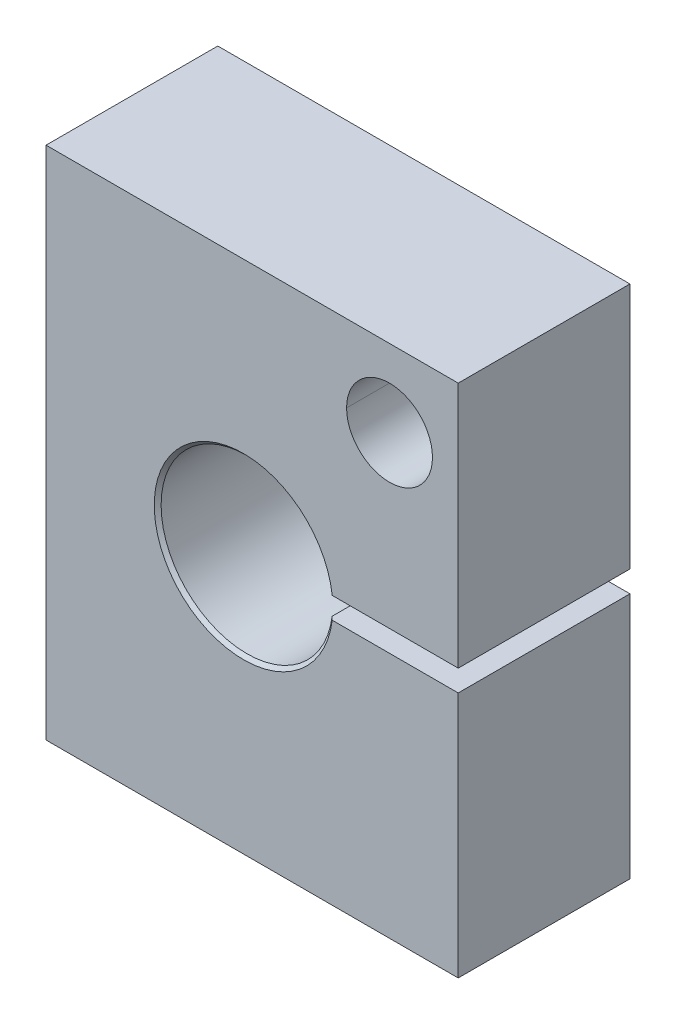
ISO-10303-21;
HEADER;
FILE_DESCRIPTION(('STEP AP214'),'2;1');
FILE_NAME('part.step','',(''),(''),'','','');
FILE_SCHEMA(('AUTOMOTIVE_DESIGN { 1 0 10303 214 1 1 1 1 }'));
ENDSEC;
DATA;
#1=APPLICATION_CONTEXT('core data for automotive mechanical design processes');
#2=APPLICATION_PROTOCOL_DEFINITION('international standard','automotive_design',2000,#1);
#3=PRODUCT_CONTEXT('',#1,'mechanical');
#4=PRODUCT('Part','Part','',(#3));
#5=PRODUCT_RELATED_PRODUCT_CATEGORY('part','',(#4));
#6=PRODUCT_DEFINITION_FORMATION('','',#4);
#7=PRODUCT_DEFINITION_CONTEXT('part definition',#1,'design');
#8=PRODUCT_DEFINITION('design','',#6,#7);
#9=PRODUCT_DEFINITION_SHAPE('','',#8);
#10=(LENGTH_UNIT() NAMED_UNIT(*) SI_UNIT(.MILLI.,.METRE.));
#11=(NAMED_UNIT(*) PLANE_ANGLE_UNIT() SI_UNIT($,.RADIAN.));
#12=(NAMED_UNIT(*) SI_UNIT($,.STERADIAN.) SOLID_ANGLE_UNIT());
#13=UNCERTAINTY_MEASURE_WITH_UNIT(LENGTH_MEASURE(1.E-05),#10,'distance_accuracy_value','');
#14=(GEOMETRIC_REPRESENTATION_CONTEXT(3) GLOBAL_UNCERTAINTY_ASSIGNED_CONTEXT((#13)) GLOBAL_UNIT_ASSIGNED_CONTEXT((#10,
#11,#12)) REPRESENTATION_CONTEXT('',''));
#15=CARTESIAN_POINT('',(0.,0.,0.));
#16=DIRECTION('',(0.,0.,1.));
#17=DIRECTION('',(1.,0.,0.));
#18=AXIS2_PLACEMENT_3D('',#15,#16,#17);
#19=CARTESIAN_POINT('',(10.16,13.335,-6.35));
#20=DIRECTION('',(0.,0.,1.));
#21=DIRECTION('',(1.,0.,0.));
#22=AXIS2_PLACEMENT_3D('',#19,#20,#21);
#23=CYLINDRICAL_SURFACE('',#22,3.175);
#24=CARTESIAN_POINT('',(10.16,13.335,-6.35));
#25=DIRECTION('',(0.,0.,1.));
#26=DIRECTION('',(1.,0.,0.));
#27=AXIS2_PLACEMENT_3D('',#24,#25,#26);
#28=CIRCLE('',#27,3.175);
#29=CARTESIAN_POINT('',(6.985,13.335,-6.35));
#30=VERTEX_POINT('',#29);
#31=CARTESIAN_POINT('',(13.335,13.335,-6.35));
#32=VERTEX_POINT('',#31);
#33=EDGE_CURVE('E508',#30,#32,#28,.T.);
#34=ORIENTED_EDGE('',*,*,#33,.F.);
#35=DIRECTION('',(0.,0.,1.));
#36=VECTOR('',#35,1.);
#37=CARTESIAN_POINT('',(6.985,13.335,-6.35));
#38=LINE('',#37,#36);
#39=CARTESIAN_POINT('',(6.985,13.335,6.35));
#40=VERTEX_POINT('',#39);
#41=EDGE_CURVE('E11',#30,#40,#38,.T.);
#42=ORIENTED_EDGE('',*,*,#41,.T.);
#43=CARTESIAN_POINT('',(10.16,13.335,6.35));
#44=DIRECTION('',(0.,0.,1.));
#45=DIRECTION('',(1.,0.,0.));
#46=AXIS2_PLACEMENT_3D('',#43,#44,#45);
#47=CIRCLE('',#46,3.175);
#48=CARTESIAN_POINT('',(13.335,13.335,6.35));
#49=VERTEX_POINT('',#48);
#50=EDGE_CURVE('E509',#40,#49,#47,.T.);
#51=ORIENTED_EDGE('',*,*,#50,.T.);
#52=DIRECTION('',(0.,0.,-1.));
#53=VECTOR('',#52,1.);
#54=CARTESIAN_POINT('',(13.335,13.335,-6.35));
#55=LINE('',#54,#53);
#56=EDGE_CURVE('E56',#49,#32,#55,.T.);
#57=ORIENTED_EDGE('',*,*,#56,.T.);
#58=EDGE_LOOP('',(#34,#42,#51,#57));
#59=FACE_BOUND('',#58,.T.);
#60=ADVANCED_FACE('F46',(#59),#23,.F.);
#61=CARTESIAN_POINT('',(-15.24,-19.05,6.35));
#62=DIRECTION('',(0.,1.,0.));
#63=DIRECTION('',(0.,0.,1.));
#64=AXIS2_PLACEMENT_3D('',#61,#62,#63);
#65=PLANE('',#64);
#66=CARTESIAN_POINT('',(-8.89,-19.05,0.));
#67=DIRECTION('',(0.,-1.,0.));
#68=DIRECTION('',(0.,0.,-1.));
#69=AXIS2_PLACEMENT_3D('',#66,#67,#68);
#70=CIRCLE('',#69,3.175);
#71=CARTESIAN_POINT('',(-8.89,-19.05,-3.175));
#72=VERTEX_POINT('',#71);
#73=EDGE_CURVE('E175',#72,#72,#70,.T.);
#74=ORIENTED_EDGE('',*,*,#73,.F.);
#75=EDGE_LOOP('',(#74));
#76=FACE_BOUND('',#75,.T.);
#77=DIRECTION('',(1.,0.,0.));
#78=VECTOR('',#77,1.);
#79=CARTESIAN_POINT('',(-15.24,-19.05,-6.35));
#80=LINE('',#79,#78);
#81=CARTESIAN_POINT('',(-15.24,-19.05,-6.35));
#82=VERTEX_POINT('',#81);
#83=CARTESIAN_POINT('',(15.24,-19.05,-6.35));
#84=VERTEX_POINT('',#83);
#85=EDGE_CURVE('E239',#82,#84,#80,.T.);
#86=ORIENTED_EDGE('',*,*,#85,.T.);
#87=DIRECTION('',(0.,0.,-1.));
#88=VECTOR('',#87,1.);
#89=CARTESIAN_POINT('',(15.24,-19.05,6.35));
#90=LINE('',#89,#88);
#91=CARTESIAN_POINT('',(15.24,-19.05,6.35));
#92=VERTEX_POINT('',#91);
#93=EDGE_CURVE('E228',#92,#84,#90,.T.);
#94=ORIENTED_EDGE('',*,*,#93,.F.);
#95=DIRECTION('',(1.,0.,0.));
#96=VECTOR('',#95,1.);
#97=CARTESIAN_POINT('',(-15.24,-19.05,6.35));
#98=LINE('',#97,#96);
#99=CARTESIAN_POINT('',(-15.24,-19.05,6.35));
#100=VERTEX_POINT('',#99);
#101=EDGE_CURVE('E226',#100,#92,#98,.T.);
#102=ORIENTED_EDGE('',*,*,#101,.F.);
#103=DIRECTION('',(0.,0.,-1.));
#104=VECTOR('',#103,1.);
#105=CARTESIAN_POINT('',(-15.24,-19.05,6.35));
#106=LINE('',#105,#104);
#107=EDGE_CURVE('E245',#100,#82,#106,.T.);
#108=ORIENTED_EDGE('',*,*,#107,.T.);
#109=EDGE_LOOP('',(#86,#94,#102,#108));
#110=FACE_BOUND('',#109,.T.);
#111=CARTESIAN_POINT('',(8.89,-19.05,0.));
#112=DIRECTION('',(0.,-1.,0.));
#113=DIRECTION('',(0.,0.,-1.));
#114=AXIS2_PLACEMENT_3D('',#111,#112,#113);
#115=CIRCLE('',#114,3.175);
#116=CARTESIAN_POINT('',(8.89,-19.05,-3.175));
#117=VERTEX_POINT('',#116);
#118=EDGE_CURVE('E174',#117,#117,#115,.T.);
#119=ORIENTED_EDGE('',*,*,#118,.F.);
#120=EDGE_LOOP('',(#119));
#121=FACE_BOUND('',#120,.T.);
#122=ADVANCED_FACE('F336',(#76,#110,#121),#65,.F.);
#123=CARTESIAN_POINT('',(15.24,19.05,6.35));
#124=DIRECTION('',(-1.,0.,0.));
#125=DIRECTION('',(0.,-1.,0.));
#126=AXIS2_PLACEMENT_3D('',#123,#124,#125);
#127=PLANE('',#126);
#128=DIRECTION('',(0.,1.,0.));
#129=VECTOR('',#128,1.);
#130=CARTESIAN_POINT('',(15.24,19.05,6.35));
#131=LINE('',#130,#129);
#132=CARTESIAN_POINT('',(15.24,0.793749999999996,6.35));
#133=VERTEX_POINT('',#132);
#134=CARTESIAN_POINT('',(15.24,19.05,6.35));
#135=VERTEX_POINT('',#134);
#136=EDGE_CURVE('E220',#133,#135,#131,.T.);
#137=ORIENTED_EDGE('',*,*,#136,.F.);
#138=DIRECTION('',(0.,0.,-1.));
#139=VECTOR('',#138,1.);
#140=CARTESIAN_POINT('',(15.24,0.793749999999996,6.35));
#141=LINE('',#140,#139);
#142=CARTESIAN_POINT('',(15.24,0.793749999999996,-6.35));
#143=VERTEX_POINT('',#142);
#144=EDGE_CURVE('E200',#133,#143,#141,.T.);
#145=ORIENTED_EDGE('',*,*,#144,.T.);
#146=DIRECTION('',(0.,1.,0.));
#147=VECTOR('',#146,1.);
#148=CARTESIAN_POINT('',(15.24,19.05,-6.35));
#149=LINE('',#148,#147);
#150=CARTESIAN_POINT('',(15.24,19.05,-6.35));
#151=VERTEX_POINT('',#150);
#152=EDGE_CURVE('E214',#143,#151,#149,.T.);
#153=ORIENTED_EDGE('',*,*,#152,.T.);
#154=DIRECTION('',(0.,0.,-1.));
#155=VECTOR('',#154,1.);
#156=CARTESIAN_POINT('',(15.24,19.05,6.35));
#157=LINE('',#156,#155);
#158=EDGE_CURVE('E253',#135,#151,#157,.T.);
#159=ORIENTED_EDGE('',*,*,#158,.F.);
#160=EDGE_LOOP('',(#137,#145,#153,#159));
#161=FACE_BOUND('',#160,.T.);
#162=ADVANCED_FACE('F327',(#161),#127,.F.);
#163=CARTESIAN_POINT('',(15.24,-0.793749999999996,-6.35));
#164=VERTEX_POINT('',#163);
#165=EDGE_CURVE('E229',#84,#164,#149,.T.);
#166=ORIENTED_EDGE('',*,*,#165,.T.);
#167=DIRECTION('',(0.,0.,-1.));
#168=VECTOR('',#167,1.);
#169=CARTESIAN_POINT('',(15.24,-0.793750000000003,6.35));
#170=LINE('',#169,#168);
#171=CARTESIAN_POINT('',(15.24,-0.793750000000003,6.35));
#172=VERTEX_POINT('',#171);
#173=EDGE_CURVE('E191',#172,#164,#170,.T.);
#174=ORIENTED_EDGE('',*,*,#173,.F.);
#175=EDGE_CURVE('E215',#92,#172,#131,.T.);
#176=ORIENTED_EDGE('',*,*,#175,.F.);
#177=ORIENTED_EDGE('',*,*,#93,.T.);
#178=EDGE_LOOP('',(#166,#174,#176,#177));
#179=FACE_BOUND('',#178,.T.);
#180=ADVANCED_FACE('F322',(#179),#127,.F.);
#181=CARTESIAN_POINT('',(-15.24,19.05,6.35));
#182=DIRECTION('',(0.,-1.,0.));
#183=DIRECTION('',(0.,0.,-1.));
#184=AXIS2_PLACEMENT_3D('',#181,#182,#183);
#185=PLANE('',#184);
#186=DIRECTION('',(-1.,0.,0.));
#187=VECTOR('',#186,1.);
#188=CARTESIAN_POINT('',(-15.24,19.05,-6.35));
#189=LINE('',#188,#187);
#190=CARTESIAN_POINT('',(-15.24,19.05,-6.35));
#191=VERTEX_POINT('',#190);
#192=EDGE_CURVE('E233',#151,#191,#189,.T.);
#193=ORIENTED_EDGE('',*,*,#192,.T.);
#194=DIRECTION('',(0.,0.,-1.));
#195=VECTOR('',#194,1.);
#196=CARTESIAN_POINT('',(-15.24,19.05,6.35));
#197=LINE('',#196,#195);
#198=CARTESIAN_POINT('',(-15.24,19.05,6.35));
#199=VERTEX_POINT('',#198);
#200=EDGE_CURVE('E249',#199,#191,#197,.T.);
#201=ORIENTED_EDGE('',*,*,#200,.F.);
#202=DIRECTION('',(-1.,0.,0.));
#203=VECTOR('',#202,1.);
#204=CARTESIAN_POINT('',(-15.24,19.05,6.35));
#205=LINE('',#204,#203);
#206=EDGE_CURVE('E219',#135,#199,#205,.T.);
#207=ORIENTED_EDGE('',*,*,#206,.F.);
#208=ORIENTED_EDGE('',*,*,#158,.T.);
#209=EDGE_LOOP('',(#193,#201,#207,#208));
#210=FACE_BOUND('',#209,.T.);
#211=ADVANCED_FACE('F326',(#210),#185,.F.);
#212=CARTESIAN_POINT('',(-15.24,19.05,6.35));
#213=DIRECTION('',(1.,0.,0.));
#214=DIRECTION('',(0.,1.,0.));
#215=AXIS2_PLACEMENT_3D('',#212,#213,#214);
#216=PLANE('',#215);
#217=DIRECTION('',(0.,-1.,0.));
#218=VECTOR('',#217,1.);
#219=CARTESIAN_POINT('',(-15.24,19.05,-6.35));
#220=LINE('',#219,#218);
#221=EDGE_CURVE('E236',#191,#82,#220,.T.);
#222=ORIENTED_EDGE('',*,*,#221,.T.);
#223=ORIENTED_EDGE('',*,*,#107,.F.);
#224=DIRECTION('',(0.,-1.,0.));
#225=VECTOR('',#224,1.);
#226=CARTESIAN_POINT('',(-15.24,19.05,6.35));
#227=LINE('',#226,#225);
#228=EDGE_CURVE('E223',#199,#100,#227,.T.);
#229=ORIENTED_EDGE('',*,*,#228,.F.);
#230=ORIENTED_EDGE('',*,*,#200,.T.);
#231=EDGE_LOOP('',(#222,#223,#229,#230));
#232=FACE_BOUND('',#231,.T.);
#233=ADVANCED_FACE('F331',(#232),#216,.F.);
#234=CARTESIAN_POINT('',(0.,0.,6.35));
#235=DIRECTION('',(0.,0.,1.));
#236=DIRECTION('',(1.,0.,0.));
#237=AXIS2_PLACEMENT_3D('',#234,#235,#236);
#238=PLANE('',#237);
#239=EDGE_CURVE('E506',#49,#40,#47,.T.);
#240=ORIENTED_EDGE('',*,*,#239,.F.);
#241=ORIENTED_EDGE('',*,*,#50,.F.);
#242=EDGE_LOOP('',(#240,#241));
#243=FACE_BOUND('',#242,.T.);
#244=DIRECTION('',(-1.,0.,0.));
#245=VECTOR('',#244,1.);
#246=CARTESIAN_POINT('',(15.24,-0.793750000000003,6.35));
#247=LINE('',#246,#245);
#248=CARTESIAN_POINT('',(5.92112514657092,-0.793750000000003,6.35));
#249=VERTEX_POINT('',#248);
#250=EDGE_CURVE('E192',#172,#249,#247,.T.);
#251=ORIENTED_EDGE('',*,*,#250,.T.);
#252=CARTESIAN_POINT('',(-0.635,0.,6.35));
#253=DIRECTION('',(0.,0.,1.));
#254=DIRECTION('',(1.,0.,0.));
#255=AXIS2_PLACEMENT_3D('',#252,#253,#254);
#256=CIRCLE('',#255,6.60399999999997);
#257=CARTESIAN_POINT('',(5.92112514657092,0.793749999999995,6.35));
#258=VERTEX_POINT('',#257);
#259=EDGE_CURVE('E315',#249,#258,#256,.F.);
#260=ORIENTED_EDGE('',*,*,#259,.T.);
#261=DIRECTION('',(1.,0.,0.));
#262=VECTOR('',#261,1.);
#263=CARTESIAN_POINT('',(15.24,0.793749999999996,6.35));
#264=LINE('',#263,#262);
#265=EDGE_CURVE('E197',#258,#133,#264,.T.);
#266=ORIENTED_EDGE('',*,*,#265,.T.);
#267=ORIENTED_EDGE('',*,*,#136,.T.);
#268=ORIENTED_EDGE('',*,*,#206,.T.);
#269=ORIENTED_EDGE('',*,*,#228,.T.);
#270=ORIENTED_EDGE('',*,*,#101,.T.);
#271=ORIENTED_EDGE('',*,*,#175,.T.);
#272=EDGE_LOOP('',(#251,#260,#266,#267,#268,#269,#270,#271));
#273=FACE_BOUND('',#272,.T.);
#274=ADVANCED_FACE('F299',(#243,#273),#238,.T.);
#275=CARTESIAN_POINT('',(0.,0.,-6.35));
#276=DIRECTION('',(0.,0.,1.));
#277=DIRECTION('',(1.,0.,0.));
#278=AXIS2_PLACEMENT_3D('',#275,#276,#277);
#279=PLANE('',#278);
#280=EDGE_CURVE('E184',#32,#30,#28,.T.);
#281=ORIENTED_EDGE('',*,*,#280,.T.);
#282=ORIENTED_EDGE('',*,*,#33,.T.);
#283=EDGE_LOOP('',(#281,#282));
#284=FACE_BOUND('',#283,.T.);
#285=DIRECTION('',(-1.,0.,0.));
#286=VECTOR('',#285,1.);
#287=CARTESIAN_POINT('',(0.,0.793749999999994,-6.35));
#288=LINE('',#287,#286);
#289=CARTESIAN_POINT('',(5.92112514657092,0.793749999999995,-6.35));
#290=VERTEX_POINT('',#289);
#291=EDGE_CURVE('E260',#143,#290,#288,.T.);
#292=ORIENTED_EDGE('',*,*,#291,.T.);
#293=CARTESIAN_POINT('',(-0.635,0.,-6.35));
#294=DIRECTION('',(0.,0.,1.));
#295=DIRECTION('',(1.,0.,0.));
#296=AXIS2_PLACEMENT_3D('',#293,#294,#295);
#297=CIRCLE('',#296,6.60399999999997);
#298=CARTESIAN_POINT('',(5.92112514657092,-0.793750000000003,-6.35));
#299=VERTEX_POINT('',#298);
#300=EDGE_CURVE('E264',#290,#299,#297,.T.);
#301=ORIENTED_EDGE('',*,*,#300,.T.);
#302=DIRECTION('',(1.,0.,0.));
#303=VECTOR('',#302,1.);
#304=CARTESIAN_POINT('',(0.,-0.793750000000003,-6.35));
#305=LINE('',#304,#303);
#306=EDGE_CURVE('E257',#299,#164,#305,.T.);
#307=ORIENTED_EDGE('',*,*,#306,.T.);
#308=ORIENTED_EDGE('',*,*,#165,.F.);
#309=ORIENTED_EDGE('',*,*,#85,.F.);
#310=ORIENTED_EDGE('',*,*,#221,.F.);
#311=ORIENTED_EDGE('',*,*,#192,.F.);
#312=ORIENTED_EDGE('',*,*,#152,.F.);
#313=EDGE_LOOP('',(#292,#301,#307,#308,#309,#310,#311,#312));
#314=FACE_BOUND('',#313,.T.);
#315=ADVANCED_FACE('F297',(#284,#314),#279,.F.);
#316=CARTESIAN_POINT('',(15.24,0.793749999999996,6.35));
#317=DIRECTION('',(0.,1.,0.));
#318=DIRECTION('',(-1.,0.,0.));
#319=AXIS2_PLACEMENT_3D('',#316,#317,#318);
#320=PLANE('',#319);
#321=DIRECTION('',(0.,0.,-1.));
#322=VECTOR('',#321,1.);
#323=CARTESIAN_POINT('',(5.66519530947256,0.793749999999995,6.35));
#324=LINE('',#323,#322);
#325=CARTESIAN_POINT('',(5.66519530947256,0.793749999999995,6.09600000000003));
#326=VERTEX_POINT('',#325);
#327=CARTESIAN_POINT('',(5.66519530947256,0.793749999999995,-6.09600000000003));
#328=VERTEX_POINT('',#327);
#329=EDGE_CURVE('E201',#326,#328,#324,.T.);
#330=ORIENTED_EDGE('',*,*,#329,.T.);
#331=CARTESIAN_POINT('',(5.66519530947256,0.793749999999995,-6.09600000000003));
#332=CARTESIAN_POINT('',(5.70785661276119,0.793749999999995,-6.1383269548065));
#333=CARTESIAN_POINT('',(5.7505147508327,0.793749999999995,-6.18065709887872));
#334=CARTESIAN_POINT('',(5.83582469653216,0.793749999999995,-6.26532376554538));
#335=CARTESIAN_POINT('',(5.8784765041601,0.793749999999995,-6.30766028813982));
#336=CARTESIAN_POINT('',(5.92112514657092,0.793749999999995,-6.35));
#337=B_SPLINE_CURVE_WITH_KNOTS('',3,(#331,#332,#333,#334,#335,#336),.UNSPECIFIED.,.F.,.F.,(4,2,
4),(0.,0.180288714478005,0.360577428916484),.UNSPECIFIED.);
#338=EDGE_CURVE('E309',#328,#290,#337,.T.);
#339=ORIENTED_EDGE('',*,*,#338,.T.);
#340=ORIENTED_EDGE('',*,*,#291,.F.);
#341=ORIENTED_EDGE('',*,*,#144,.F.);
#342=ORIENTED_EDGE('',*,*,#265,.F.);
#343=CARTESIAN_POINT('',(5.92112514657092,0.793749999999995,6.35));
#344=CARTESIAN_POINT('',(5.87847650416009,0.793749999999995,6.30766028813982));
#345=CARTESIAN_POINT('',(5.83582469653216,0.793749999999995,6.26532376554538));
#346=CARTESIAN_POINT('',(5.7505147508327,0.793749999999995,6.18065709887872));
#347=CARTESIAN_POINT('',(5.70785661276119,0.793749999999995,6.1383269548065));
#348=CARTESIAN_POINT('',(5.66519530947256,0.793749999999995,6.09600000000003));
#349=B_SPLINE_CURVE_WITH_KNOTS('',3,(#343,#344,#345,#346,#347,#348),.UNSPECIFIED.,.F.,.F.,(4,2,
4),(0.,0.180288714438479,0.360577428916482),.UNSPECIFIED.);
#350=EDGE_CURVE('E303',#258,#326,#349,.T.);
#351=ORIENTED_EDGE('',*,*,#350,.T.);
#352=EDGE_LOOP('',(#330,#339,#340,#341,#342,#351));
#353=FACE_BOUND('',#352,.T.);
#354=ADVANCED_FACE('F292',(#353),#320,.F.);
#355=CARTESIAN_POINT('',(-0.635,0.,6.35));
#356=DIRECTION('',(0.,0.,-1.));
#357=DIRECTION('',(-1.,0.,0.));
#358=AXIS2_PLACEMENT_3D('',#355,#356,#357);
#359=CYLINDRICAL_SURFACE('',#358,6.35);
#360=DIRECTION('',(0.,0.,-1.));
#361=VECTOR('',#360,1.);
#362=CARTESIAN_POINT('',(5.66519530947256,-0.793750000000006,6.35));
#363=LINE('',#362,#361);
#364=CARTESIAN_POINT('',(5.66519530947256,-0.793750000000006,6.09600000000003));
#365=VERTEX_POINT('',#364);
#366=CARTESIAN_POINT('',(5.66519530947256,-0.793750000000006,-6.09600000000002));
#367=VERTEX_POINT('',#366);
#368=EDGE_CURVE('E196',#365,#367,#363,.T.);
#369=ORIENTED_EDGE('',*,*,#368,.T.);
#370=CARTESIAN_POINT('',(-0.635,0.,-6.09600000000003));
#371=DIRECTION('',(0.,0.,1.));
#372=DIRECTION('',(1.,0.,0.));
#373=AXIS2_PLACEMENT_3D('',#370,#371,#372);
#374=CIRCLE('',#373,6.35);
#375=EDGE_CURVE('E520',#367,#328,#374,.F.);
#376=ORIENTED_EDGE('',*,*,#375,.T.);
#377=ORIENTED_EDGE('',*,*,#329,.F.);
#378=CARTESIAN_POINT('',(-0.635,0.,6.09600000000003));
#379=DIRECTION('',(0.,0.,1.));
#380=DIRECTION('',(1.,0.,0.));
#381=AXIS2_PLACEMENT_3D('',#378,#379,#380);
#382=CIRCLE('',#381,6.35);
#383=EDGE_CURVE('E521',#326,#365,#382,.T.);
#384=ORIENTED_EDGE('',*,*,#383,.T.);
#385=EDGE_LOOP('',(#369,#376,#377,#384));
#386=FACE_BOUND('',#385,.T.);
#387=ADVANCED_FACE('F286',(#386),#359,.F.);
#388=CARTESIAN_POINT('',(15.24,-0.793750000000003,6.35));
#389=DIRECTION('',(0.,-1.,0.));
#390=DIRECTION('',(0.,0.,-1.));
#391=AXIS2_PLACEMENT_3D('',#388,#389,#390);
#392=PLANE('',#391);
#393=ORIENTED_EDGE('',*,*,#306,.F.);
#394=CARTESIAN_POINT('',(5.92112514657092,-0.793750000000003,-6.35));
#395=CARTESIAN_POINT('',(5.8784765041601,-0.793750000000003,-6.30766028813982));
#396=CARTESIAN_POINT('',(5.83582469653216,-0.793750000000003,-6.26532376554538));
#397=CARTESIAN_POINT('',(5.7505147508327,-0.793750000000003,-6.18065709887872));
#398=CARTESIAN_POINT('',(5.70785661276119,-0.793750000000003,-6.1383269548065));
#399=CARTESIAN_POINT('',(5.66519530947256,-0.793750000000003,-6.09600000000003));
#400=B_SPLINE_CURVE_WITH_KNOTS('',3,(#394,#395,#396,#397,#398,#399),.UNSPECIFIED.,.F.,.F.,(4,2,
4),(0.,0.180288714438479,0.360577428916484),.UNSPECIFIED.);
#401=EDGE_CURVE('E275',#299,#367,#400,.T.);
#402=ORIENTED_EDGE('',*,*,#401,.T.);
#403=ORIENTED_EDGE('',*,*,#368,.F.);
#404=CARTESIAN_POINT('',(5.66519530947256,-0.793750000000006,6.09600000000003));
#405=CARTESIAN_POINT('',(5.70785661276119,-0.793750000000004,6.1383269548065));
#406=CARTESIAN_POINT('',(5.7505147508327,-0.793750000000003,6.18065709887872));
#407=CARTESIAN_POINT('',(5.83582469653216,-0.793750000000002,6.26532376554538));
#408=CARTESIAN_POINT('',(5.87847650416009,-0.793750000000002,6.30766028813982));
#409=CARTESIAN_POINT('',(5.92112514657092,-0.793750000000003,6.35));
#410=B_SPLINE_CURVE_WITH_KNOTS('',3,(#404,#405,#406,#407,#408,#409),.UNSPECIFIED.,.F.,.F.,(4,2,
4),(0.,0.180288714478004,0.360577428916482),.UNSPECIFIED.);
#411=EDGE_CURVE('E268',#365,#249,#410,.T.);
#412=ORIENTED_EDGE('',*,*,#411,.T.);
#413=ORIENTED_EDGE('',*,*,#250,.F.);
#414=ORIENTED_EDGE('',*,*,#173,.T.);
#415=EDGE_LOOP('',(#393,#402,#403,#412,#413,#414));
#416=FACE_BOUND('',#415,.T.);
#417=ADVANCED_FACE('F280',(#416),#392,.F.);
#418=CARTESIAN_POINT('',(8.89,-11.43,0.));
#419=DIRECTION('',(0.,-1.,0.));
#420=DIRECTION('',(0.,0.,-1.));
#421=AXIS2_PLACEMENT_3D('',#418,#419,#420);
#422=CONICAL_SURFACE('',#421,3.175,1.02974425867665);
#423=CARTESIAN_POINT('',(8.89,-9.5222675345875,0.));
#424=VERTEX_POINT('',#423);
#425=VERTEX_LOOP('',#424);
#426=FACE_BOUND('',#425,.T.);
#427=CARTESIAN_POINT('',(8.89,-11.43,0.));
#428=DIRECTION('',(0.,-1.,0.));
#429=DIRECTION('',(0.,0.,-1.));
#430=AXIS2_PLACEMENT_3D('',#427,#428,#429);
#431=CIRCLE('',#430,3.175);
#432=CARTESIAN_POINT('',(8.89,-11.43,-3.175));
#433=VERTEX_POINT('',#432);
#434=EDGE_CURVE('E181',#433,#433,#431,.T.);
#435=ORIENTED_EDGE('',*,*,#434,.T.);
#436=EDGE_LOOP('',(#435));
#437=FACE_BOUND('',#436,.T.);
#438=ADVANCED_FACE('F285',(#426,#437),#422,.F.);
#439=CARTESIAN_POINT('',(8.89,-19.05,0.));
#440=DIRECTION('',(0.,-1.,0.));
#441=DIRECTION('',(0.,0.,-1.));
#442=AXIS2_PLACEMENT_3D('',#439,#440,#441);
#443=CYLINDRICAL_SURFACE('',#442,3.175);
#444=ORIENTED_EDGE('',*,*,#434,.F.);
#445=EDGE_LOOP('',(#444));
#446=FACE_BOUND('',#445,.T.);
#447=ORIENTED_EDGE('',*,*,#118,.T.);
#448=EDGE_LOOP('',(#447));
#449=FACE_BOUND('',#448,.T.);
#450=ADVANCED_FACE('F320',(#446,#449),#443,.F.);
#451=CARTESIAN_POINT('',(-0.635,0.,-6.35));
#452=DIRECTION('',(0.,0.,-1.));
#453=DIRECTION('',(-1.,0.,0.));
#454=AXIS2_PLACEMENT_3D('',#451,#452,#453);
#455=CONICAL_SURFACE('',#454,6.60399999999997,0.785398163397447);
#456=ORIENTED_EDGE('',*,*,#338,.F.);
#457=ORIENTED_EDGE('',*,*,#375,.F.);
#458=ORIENTED_EDGE('',*,*,#401,.F.);
#459=ORIENTED_EDGE('',*,*,#300,.F.);
#460=EDGE_LOOP('',(#456,#457,#458,#459));
#461=FACE_BOUND('',#460,.T.);
#462=ADVANCED_FACE('F316',(#461),#455,.F.);
#463=CARTESIAN_POINT('',(-0.635,0.,6.35));
#464=DIRECTION('',(0.,0.,1.));
#465=DIRECTION('',(1.,0.,0.));
#466=AXIS2_PLACEMENT_3D('',#463,#464,#465);
#467=CONICAL_SURFACE('',#466,6.60399999999997,0.785398163397447);
#468=ORIENTED_EDGE('',*,*,#411,.F.);
#469=ORIENTED_EDGE('',*,*,#383,.F.);
#470=ORIENTED_EDGE('',*,*,#350,.F.);
#471=ORIENTED_EDGE('',*,*,#259,.F.);
#472=EDGE_LOOP('',(#468,#469,#470,#471));
#473=FACE_BOUND('',#472,.T.);
#474=ADVANCED_FACE('F48',(#473),#467,.F.);
#475=CARTESIAN_POINT('',(-8.89,-11.43,0.));
#476=DIRECTION('',(0.,-1.,0.));
#477=DIRECTION('',(0.,0.,-1.));
#478=AXIS2_PLACEMENT_3D('',#475,#476,#477);
#479=CONICAL_SURFACE('',#478,3.175,1.02974425867665);
#480=CARTESIAN_POINT('',(-8.89,-9.5222675345875,0.));
#481=VERTEX_POINT('',#480);
#482=VERTEX_LOOP('',#481);
#483=FACE_BOUND('',#482,.T.);
#484=CARTESIAN_POINT('',(-8.89,-11.43,0.));
#485=DIRECTION('',(0.,-1.,0.));
#486=DIRECTION('',(0.,0.,-1.));
#487=AXIS2_PLACEMENT_3D('',#484,#485,#486);
#488=CIRCLE('',#487,3.175);
#489=CARTESIAN_POINT('',(-8.89,-11.43,-3.175));
#490=VERTEX_POINT('',#489);
#491=EDGE_CURVE('E171',#490,#490,#488,.T.);
#492=ORIENTED_EDGE('',*,*,#491,.T.);
#493=EDGE_LOOP('',(#492));
#494=FACE_BOUND('',#493,.T.);
#495=ADVANCED_FACE('F164',(#483,#494),#479,.F.);
#496=CARTESIAN_POINT('',(-8.89,-19.05,0.));
#497=DIRECTION('',(0.,-1.,0.));
#498=DIRECTION('',(0.,0.,-1.));
#499=AXIS2_PLACEMENT_3D('',#496,#497,#498);
#500=CYLINDRICAL_SURFACE('',#499,3.175);
#501=ORIENTED_EDGE('',*,*,#491,.F.);
#502=EDGE_LOOP('',(#501));
#503=FACE_BOUND('',#502,.T.);
#504=ORIENTED_EDGE('',*,*,#73,.T.);
#505=EDGE_LOOP('',(#504));
#506=FACE_BOUND('',#505,.T.);
#507=ADVANCED_FACE('F167',(#503,#506),#500,.F.);
#508=ORIENTED_EDGE('',*,*,#41,.F.);
#509=ORIENTED_EDGE('',*,*,#280,.F.);
#510=ORIENTED_EDGE('',*,*,#56,.F.);
#511=ORIENTED_EDGE('',*,*,#239,.T.);
#512=EDGE_LOOP('',(#508,#509,#510,#511));
#513=FACE_BOUND('',#512,.T.);
#514=ADVANCED_FACE('F349',(#513),#23,.F.);
#515=CLOSED_SHELL('',(#60,#122,#162,#180,#211,#233,#274,#315,#354,#387,#417,#438,#450,#462,#474,
#495,#507,#514));
#516=MANIFOLD_SOLID_BREP('B2',#515);
#517=ADVANCED_BREP_SHAPE_REPRESENTATION('',(#18,#516),#14);
#518=SHAPE_DEFINITION_REPRESENTATION(#9,#517);
ENDSEC;
END-ISO-10303-21;
